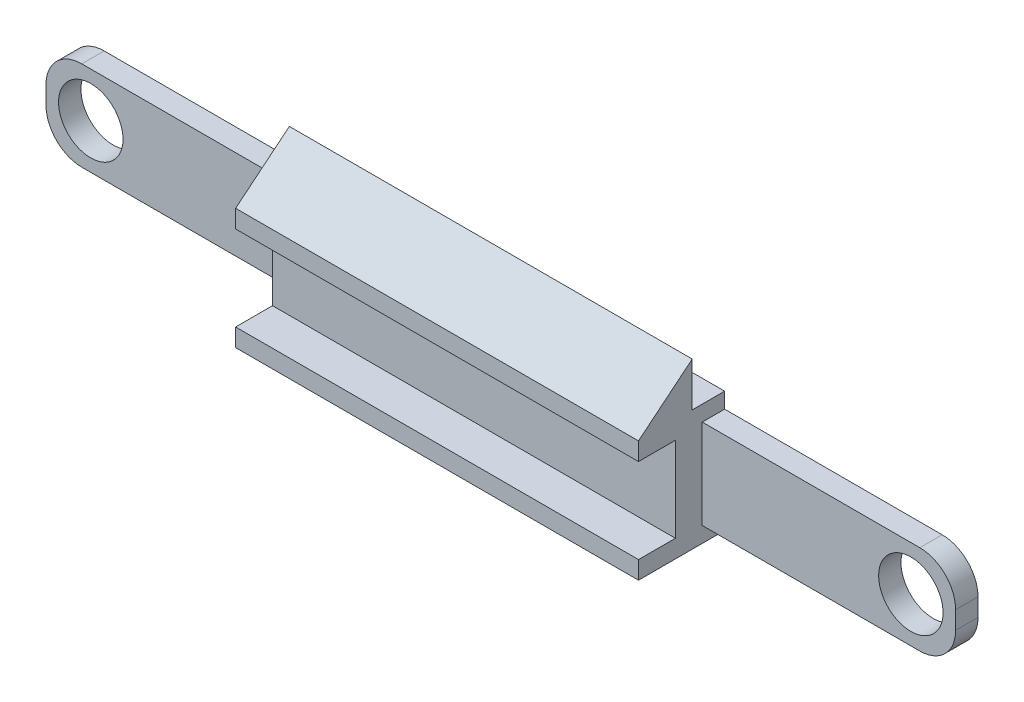
ISO-10303-21;
HEADER;
FILE_DESCRIPTION(('STEP AP214'),'2;1');
FILE_NAME('part.step','',(''),(''),'','','');
FILE_SCHEMA(('AUTOMOTIVE_DESIGN { 1 0 10303 214 1 1 1 1 }'));
ENDSEC;
DATA;
#1=APPLICATION_CONTEXT('core data for automotive mechanical design processes');
#2=APPLICATION_PROTOCOL_DEFINITION('international standard','automotive_design',2000,#1);
#3=PRODUCT_CONTEXT('',#1,'mechanical');
#4=PRODUCT('Part','Part','',(#3));
#5=PRODUCT_RELATED_PRODUCT_CATEGORY('part','',(#4));
#6=PRODUCT_DEFINITION_FORMATION('','',#4);
#7=PRODUCT_DEFINITION_CONTEXT('part definition',#1,'design');
#8=PRODUCT_DEFINITION('design','',#6,#7);
#9=PRODUCT_DEFINITION_SHAPE('','',#8);
#10=(LENGTH_UNIT() NAMED_UNIT(*) SI_UNIT(.MILLI.,.METRE.));
#11=(NAMED_UNIT(*) PLANE_ANGLE_UNIT() SI_UNIT($,.RADIAN.));
#12=(NAMED_UNIT(*) SI_UNIT($,.STERADIAN.) SOLID_ANGLE_UNIT());
#13=UNCERTAINTY_MEASURE_WITH_UNIT(LENGTH_MEASURE(1.E-05),#10,'distance_accuracy_value','');
#14=(GEOMETRIC_REPRESENTATION_CONTEXT(3) GLOBAL_UNCERTAINTY_ASSIGNED_CONTEXT((#13)) GLOBAL_UNIT_ASSIGNED_CONTEXT((#10,
#11,#12)) REPRESENTATION_CONTEXT('',''));
#15=CARTESIAN_POINT('',(0.,0.,0.));
#16=DIRECTION('',(0.,0.,1.));
#17=DIRECTION('',(1.,0.,0.));
#18=AXIS2_PLACEMENT_3D('',#15,#16,#17);
#19=CARTESIAN_POINT('',(59.436,-1.27,3.175));
#20=DIRECTION('',(0.,0.,1.));
#21=DIRECTION('',(1.,0.,0.));
#22=AXIS2_PLACEMENT_3D('',#19,#20,#21);
#23=PLANE('',#22);
#24=CARTESIAN_POINT('',(58.166,0.,3.175));
#25=DIRECTION('',(0.,0.,1.));
#26=DIRECTION('',(-1.,0.,0.));
#27=AXIS2_PLACEMENT_3D('',#24,#25,#26);
#28=CIRCLE('',#27,4.572);
#29=CARTESIAN_POINT('',(53.594,0.,3.175));
#30=VERTEX_POINT('',#29);
#31=EDGE_CURVE('E291',#30,#30,#28,.T.);
#32=ORIENTED_EDGE('',*,*,#31,.F.);
#33=EDGE_LOOP('',(#32));
#34=FACE_BOUND('',#33,.T.);
#35=DIRECTION('',(-1.,0.,0.));
#36=VECTOR('',#35,1.);
#37=CARTESIAN_POINT('',(59.436,6.35,3.175));
#38=LINE('',#37,#36);
#39=CARTESIAN_POINT('',(59.436,6.35,3.175));
#40=VERTEX_POINT('',#39);
#41=CARTESIAN_POINT('',(28.575,6.35,3.175));
#42=VERTEX_POINT('',#41);
#43=EDGE_CURVE('E312',#40,#42,#38,.T.);
#44=ORIENTED_EDGE('',*,*,#43,.T.);
#45=DIRECTION('',(0.,1.,0.));
#46=VECTOR('',#45,1.);
#47=CARTESIAN_POINT('',(28.575,0.330199999999999,3.175));
#48=LINE('',#47,#46);
#49=CARTESIAN_POINT('',(28.575,-6.35,3.175));
#50=VERTEX_POINT('',#49);
#51=EDGE_CURVE('E44',#50,#42,#48,.T.);
#52=ORIENTED_EDGE('',*,*,#51,.F.);
#53=DIRECTION('',(1.,0.,0.));
#54=VECTOR('',#53,1.);
#55=CARTESIAN_POINT('',(59.436,-6.35,3.175));
#56=LINE('',#55,#54);
#57=CARTESIAN_POINT('',(59.436,-6.35,3.175));
#58=VERTEX_POINT('',#57);
#59=EDGE_CURVE('E321',#50,#58,#56,.T.);
#60=ORIENTED_EDGE('',*,*,#59,.T.);
#61=CARTESIAN_POINT('',(59.436,-1.27,3.175));
#62=DIRECTION('',(0.,0.,1.));
#63=DIRECTION('',(1.,0.,0.));
#64=AXIS2_PLACEMENT_3D('',#61,#62,#63);
#65=CIRCLE('',#64,5.07999999999999);
#66=CARTESIAN_POINT('',(64.516,-1.27,3.175));
#67=VERTEX_POINT('',#66);
#68=EDGE_CURVE('E303',#58,#67,#65,.T.);
#69=ORIENTED_EDGE('',*,*,#68,.T.);
#70=DIRECTION('',(0.,1.,0.));
#71=VECTOR('',#70,1.);
#72=CARTESIAN_POINT('',(64.516,-1.27,3.175));
#73=LINE('',#72,#71);
#74=CARTESIAN_POINT('',(64.516,1.27,3.175));
#75=VERTEX_POINT('',#74);
#76=EDGE_CURVE('E306',#67,#75,#73,.T.);
#77=ORIENTED_EDGE('',*,*,#76,.T.);
#78=CARTESIAN_POINT('',(59.436,1.27,3.175));
#79=DIRECTION('',(0.,0.,1.));
#80=DIRECTION('',(1.,0.,0.));
#81=AXIS2_PLACEMENT_3D('',#78,#79,#80);
#82=CIRCLE('',#81,5.08);
#83=EDGE_CURVE('E309',#75,#40,#82,.T.);
#84=ORIENTED_EDGE('',*,*,#83,.T.);
#85=EDGE_LOOP('',(#44,#52,#60,#69,#77,#84));
#86=FACE_BOUND('',#85,.T.);
#87=ADVANCED_FACE('F35',(#34,#86),#23,.T.);
#88=CARTESIAN_POINT('',(59.436,6.35,3.175));
#89=DIRECTION('',(0.,-1.,0.));
#90=DIRECTION('',(0.,0.,-1.));
#91=AXIS2_PLACEMENT_3D('',#88,#89,#90);
#92=PLANE('',#91);
#93=CARTESIAN_POINT('',(-28.575,6.35,3.175));
#94=VERTEX_POINT('',#93);
#95=CARTESIAN_POINT('',(-59.436,6.35,3.175));
#96=VERTEX_POINT('',#95);
#97=EDGE_CURVE('E311',#94,#96,#38,.T.);
#98=ORIENTED_EDGE('',*,*,#97,.F.);
#99=DIRECTION('',(0.,0.,-1.));
#100=VECTOR('',#99,1.);
#101=CARTESIAN_POINT('',(-28.575,6.35,3.175));
#102=LINE('',#101,#100);
#103=CARTESIAN_POINT('',(-28.575,6.35,0.));
#104=VERTEX_POINT('',#103);
#105=EDGE_CURVE('E230',#94,#104,#102,.T.);
#106=ORIENTED_EDGE('',*,*,#105,.T.);
#107=DIRECTION('',(-1.,0.,0.));
#108=VECTOR('',#107,1.);
#109=CARTESIAN_POINT('',(59.436,6.35,0.));
#110=LINE('',#109,#108);
#111=CARTESIAN_POINT('',(-59.436,6.35,0.));
#112=VERTEX_POINT('',#111);
#113=EDGE_CURVE('E331',#104,#112,#110,.T.);
#114=ORIENTED_EDGE('',*,*,#113,.T.);
#115=DIRECTION('',(0.,0.,-1.));
#116=VECTOR('',#115,1.);
#117=CARTESIAN_POINT('',(-59.436,6.35,3.175));
#118=LINE('',#117,#116);
#119=EDGE_CURVE('E354',#96,#112,#118,.T.);
#120=ORIENTED_EDGE('',*,*,#119,.F.);
#121=EDGE_LOOP('',(#98,#106,#114,#120));
#122=FACE_BOUND('',#121,.T.);
#123=ADVANCED_FACE('F422',(#122),#92,.F.);
#124=DIRECTION('',(0.,1.,0.));
#125=VECTOR('',#124,1.);
#126=CARTESIAN_POINT('',(-28.575,0.330199999999999,3.175));
#127=LINE('',#126,#125);
#128=CARTESIAN_POINT('',(-28.575,-6.35,3.175));
#129=VERTEX_POINT('',#128);
#130=EDGE_CURVE('E11',#129,#94,#127,.T.);
#131=ORIENTED_EDGE('',*,*,#130,.T.);
#132=ORIENTED_EDGE('',*,*,#97,.T.);
#133=CARTESIAN_POINT('',(-59.436,1.27,3.175));
#134=DIRECTION('',(0.,0.,1.));
#135=DIRECTION('',(1.,0.,0.));
#136=AXIS2_PLACEMENT_3D('',#133,#134,#135);
#137=CIRCLE('',#136,5.08);
#138=CARTESIAN_POINT('',(-64.516,1.27,3.175));
#139=VERTEX_POINT('',#138);
#140=EDGE_CURVE('E315',#96,#139,#137,.T.);
#141=ORIENTED_EDGE('',*,*,#140,.T.);
#142=DIRECTION('',(0.,-1.,0.));
#143=VECTOR('',#142,1.);
#144=CARTESIAN_POINT('',(-64.516,-1.27,3.175));
#145=LINE('',#144,#143);
#146=CARTESIAN_POINT('',(-64.516,-1.27,3.175));
#147=VERTEX_POINT('',#146);
#148=EDGE_CURVE('E317',#139,#147,#145,.T.);
#149=ORIENTED_EDGE('',*,*,#148,.T.);
#150=CARTESIAN_POINT('',(-59.436,-1.27,3.175));
#151=DIRECTION('',(0.,0.,1.));
#152=DIRECTION('',(-1.,0.,0.));
#153=AXIS2_PLACEMENT_3D('',#150,#151,#152);
#154=CIRCLE('',#153,5.07999999999999);
#155=CARTESIAN_POINT('',(-59.436,-6.35,3.175));
#156=VERTEX_POINT('',#155);
#157=EDGE_CURVE('E319',#147,#156,#154,.T.);
#158=ORIENTED_EDGE('',*,*,#157,.T.);
#159=EDGE_CURVE('E322',#156,#129,#56,.T.);
#160=ORIENTED_EDGE('',*,*,#159,.T.);
#161=EDGE_LOOP('',(#131,#132,#141,#149,#158,#160));
#162=FACE_BOUND('',#161,.T.);
#163=CARTESIAN_POINT('',(-58.166,0.,3.175));
#164=DIRECTION('',(0.,0.,1.));
#165=DIRECTION('',(1.,0.,0.));
#166=AXIS2_PLACEMENT_3D('',#163,#164,#165);
#167=CIRCLE('',#166,4.572);
#168=CARTESIAN_POINT('',(-53.594,0.,3.175));
#169=VERTEX_POINT('',#168);
#170=EDGE_CURVE('E297',#169,#169,#167,.T.);
#171=ORIENTED_EDGE('',*,*,#170,.F.);
#172=EDGE_LOOP('',(#171));
#173=FACE_BOUND('',#172,.T.);
#174=ADVANCED_FACE('F453',(#162,#173),#23,.T.);
#175=CARTESIAN_POINT('',(59.436,-6.35,3.175));
#176=DIRECTION('',(0.,1.,0.));
#177=DIRECTION('',(0.,0.,1.));
#178=AXIS2_PLACEMENT_3D('',#175,#176,#177);
#179=PLANE('',#178);
#180=DIRECTION('',(0.,0.,-1.));
#181=VECTOR('',#180,1.);
#182=CARTESIAN_POINT('',(-28.575,-6.35,3.175));
#183=LINE('',#182,#181);
#184=CARTESIAN_POINT('',(-28.575,-6.35,0.));
#185=VERTEX_POINT('',#184);
#186=EDGE_CURVE('E273',#129,#185,#183,.T.);
#187=ORIENTED_EDGE('',*,*,#186,.F.);
#188=ORIENTED_EDGE('',*,*,#159,.F.);
#189=DIRECTION('',(0.,0.,-1.));
#190=VECTOR('',#189,1.);
#191=CARTESIAN_POINT('',(-59.436,-6.35,3.175));
#192=LINE('',#191,#190);
#193=CARTESIAN_POINT('',(-59.436,-6.35,0.));
#194=VERTEX_POINT('',#193);
#195=EDGE_CURVE('E345',#156,#194,#192,.T.);
#196=ORIENTED_EDGE('',*,*,#195,.T.);
#197=DIRECTION('',(1.,0.,0.));
#198=VECTOR('',#197,1.);
#199=CARTESIAN_POINT('',(59.436,-6.35,0.));
#200=LINE('',#199,#198);
#201=EDGE_CURVE('E307',#194,#185,#200,.T.);
#202=ORIENTED_EDGE('',*,*,#201,.T.);
#203=EDGE_LOOP('',(#187,#188,#196,#202));
#204=FACE_BOUND('',#203,.T.);
#205=ADVANCED_FACE('F402',(#204),#179,.F.);
#206=DIRECTION('',(0.,0.,1.));
#207=VECTOR('',#206,1.);
#208=CARTESIAN_POINT('',(28.575,-6.35,3.17500000000001));
#209=LINE('',#208,#207);
#210=CARTESIAN_POINT('',(28.575,-6.35,0.));
#211=VERTEX_POINT('',#210);
#212=EDGE_CURVE('E278',#211,#50,#209,.T.);
#213=ORIENTED_EDGE('',*,*,#212,.F.);
#214=CARTESIAN_POINT('',(59.436,-6.35,0.));
#215=VERTEX_POINT('',#214);
#216=EDGE_CURVE('E340',#211,#215,#200,.T.);
#217=ORIENTED_EDGE('',*,*,#216,.T.);
#218=DIRECTION('',(0.,0.,-1.));
#219=VECTOR('',#218,1.);
#220=CARTESIAN_POINT('',(59.436,-6.35,3.175));
#221=LINE('',#220,#219);
#222=EDGE_CURVE('E324',#58,#215,#221,.T.);
#223=ORIENTED_EDGE('',*,*,#222,.F.);
#224=ORIENTED_EDGE('',*,*,#59,.F.);
#225=EDGE_LOOP('',(#213,#217,#223,#224));
#226=FACE_BOUND('',#225,.T.);
#227=ADVANCED_FACE('F389',(#226),#179,.F.);
#228=CARTESIAN_POINT('',(59.436,-1.27,0.));
#229=DIRECTION('',(0.,0.,1.));
#230=DIRECTION('',(1.,0.,0.));
#231=AXIS2_PLACEMENT_3D('',#228,#229,#230);
#232=PLANE('',#231);
#233=CARTESIAN_POINT('',(59.436,-1.27,0.));
#234=DIRECTION('',(0.,0.,1.));
#235=DIRECTION('',(1.,0.,0.));
#236=AXIS2_PLACEMENT_3D('',#233,#234,#235);
#237=CIRCLE('',#236,5.07999999999999);
#238=CARTESIAN_POINT('',(64.516,-1.27,0.));
#239=VERTEX_POINT('',#238);
#240=EDGE_CURVE('E300',#215,#239,#237,.T.);
#241=ORIENTED_EDGE('',*,*,#240,.F.);
#242=ORIENTED_EDGE('',*,*,#216,.F.);
#243=DIRECTION('',(0.,1.,0.));
#244=VECTOR('',#243,1.);
#245=CARTESIAN_POINT('',(28.575,-8.5598,0.));
#246=LINE('',#245,#244);
#247=CARTESIAN_POINT('',(28.575,-8.5598,0.));
#248=VERTEX_POINT('',#247);
#249=EDGE_CURVE('E282',#248,#211,#246,.T.);
#250=ORIENTED_EDGE('',*,*,#249,.F.);
#251=DIRECTION('',(1.,0.,0.));
#252=VECTOR('',#251,1.);
#253=CARTESIAN_POINT('',(-28.575,-8.5598,0.));
#254=LINE('',#253,#252);
#255=CARTESIAN_POINT('',(-28.575,-8.5598,0.));
#256=VERTEX_POINT('',#255);
#257=EDGE_CURVE('E277',#256,#248,#254,.T.);
#258=ORIENTED_EDGE('',*,*,#257,.F.);
#259=DIRECTION('',(0.,1.,0.));
#260=VECTOR('',#259,1.);
#261=CARTESIAN_POINT('',(-28.575,-8.5598,0.));
#262=LINE('',#261,#260);
#263=EDGE_CURVE('E288',#256,#185,#262,.T.);
#264=ORIENTED_EDGE('',*,*,#263,.T.);
#265=ORIENTED_EDGE('',*,*,#201,.F.);
#266=CARTESIAN_POINT('',(-59.436,-1.27,0.));
#267=DIRECTION('',(0.,0.,1.));
#268=DIRECTION('',(-1.,0.,0.));
#269=AXIS2_PLACEMENT_3D('',#266,#267,#268);
#270=CIRCLE('',#269,5.07999999999999);
#271=CARTESIAN_POINT('',(-64.516,-1.27,0.));
#272=VERTEX_POINT('',#271);
#273=EDGE_CURVE('E338',#272,#194,#270,.T.);
#274=ORIENTED_EDGE('',*,*,#273,.F.);
#275=DIRECTION('',(0.,-1.,0.));
#276=VECTOR('',#275,1.);
#277=CARTESIAN_POINT('',(-64.516,-1.27,0.));
#278=LINE('',#277,#276);
#279=CARTESIAN_POINT('',(-64.516,1.27,0.));
#280=VERTEX_POINT('',#279);
#281=EDGE_CURVE('E336',#280,#272,#278,.T.);
#282=ORIENTED_EDGE('',*,*,#281,.F.);
#283=CARTESIAN_POINT('',(-59.436,1.27,0.));
#284=DIRECTION('',(0.,0.,1.));
#285=DIRECTION('',(1.,0.,0.));
#286=AXIS2_PLACEMENT_3D('',#283,#284,#285);
#287=CIRCLE('',#286,5.08);
#288=EDGE_CURVE('E334',#112,#280,#287,.T.);
#289=ORIENTED_EDGE('',*,*,#288,.F.);
#290=ORIENTED_EDGE('',*,*,#113,.F.);
#291=DIRECTION('',(0.,-1.,0.));
#292=VECTOR('',#291,1.);
#293=CARTESIAN_POINT('',(-28.575,8.5598,0.));
#294=LINE('',#293,#292);
#295=CARTESIAN_POINT('',(-28.575,8.5598,0.));
#296=VERTEX_POINT('',#295);
#297=EDGE_CURVE('E239',#296,#104,#294,.T.);
#298=ORIENTED_EDGE('',*,*,#297,.F.);
#299=DIRECTION('',(1.,0.,0.));
#300=VECTOR('',#299,1.);
#301=CARTESIAN_POINT('',(-28.575,8.5598,0.));
#302=LINE('',#301,#300);
#303=CARTESIAN_POINT('',(28.575,8.5598,0.));
#304=VERTEX_POINT('',#303);
#305=EDGE_CURVE('E236',#296,#304,#302,.T.);
#306=ORIENTED_EDGE('',*,*,#305,.T.);
#307=DIRECTION('',(0.,-1.,0.));
#308=VECTOR('',#307,1.);
#309=CARTESIAN_POINT('',(28.575,8.5598,0.));
#310=LINE('',#309,#308);
#311=CARTESIAN_POINT('',(28.575,6.35,0.));
#312=VERTEX_POINT('',#311);
#313=EDGE_CURVE('E246',#304,#312,#310,.T.);
#314=ORIENTED_EDGE('',*,*,#313,.T.);
#315=CARTESIAN_POINT('',(59.436,6.35,0.));
#316=VERTEX_POINT('',#315);
#317=EDGE_CURVE('E332',#316,#312,#110,.T.);
#318=ORIENTED_EDGE('',*,*,#317,.F.);
#319=CARTESIAN_POINT('',(59.436,1.27,0.));
#320=DIRECTION('',(0.,0.,1.));
#321=DIRECTION('',(1.,0.,0.));
#322=AXIS2_PLACEMENT_3D('',#319,#320,#321);
#323=CIRCLE('',#322,5.08);
#324=CARTESIAN_POINT('',(64.516,1.27,0.));
#325=VERTEX_POINT('',#324);
#326=EDGE_CURVE('E329',#325,#316,#323,.T.);
#327=ORIENTED_EDGE('',*,*,#326,.F.);
#328=DIRECTION('',(0.,1.,0.));
#329=VECTOR('',#328,1.);
#330=CARTESIAN_POINT('',(64.516,-1.27,0.));
#331=LINE('',#330,#329);
#332=EDGE_CURVE('E327',#239,#325,#331,.T.);
#333=ORIENTED_EDGE('',*,*,#332,.F.);
#334=EDGE_LOOP('',(#241,#242,#250,#258,#264,#265,#274,#282,#289,#290,#298,#306,#314,#318,#327,#333));
#335=FACE_BOUND('',#334,.T.);
#336=CARTESIAN_POINT('',(-58.166,0.,0.));
#337=DIRECTION('',(0.,0.,1.));
#338=DIRECTION('',(1.,0.,0.));
#339=AXIS2_PLACEMENT_3D('',#336,#337,#338);
#340=CIRCLE('',#339,4.572);
#341=CARTESIAN_POINT('',(-53.594,0.,0.));
#342=VERTEX_POINT('',#341);
#343=EDGE_CURVE('E294',#342,#342,#340,.T.);
#344=ORIENTED_EDGE('',*,*,#343,.T.);
#345=EDGE_LOOP('',(#344));
#346=FACE_BOUND('',#345,.T.);
#347=CARTESIAN_POINT('',(58.166,0.,0.));
#348=DIRECTION('',(0.,0.,1.));
#349=DIRECTION('',(-1.,0.,0.));
#350=AXIS2_PLACEMENT_3D('',#347,#348,#349);
#351=CIRCLE('',#350,4.572);
#352=CARTESIAN_POINT('',(53.594,0.,0.));
#353=VERTEX_POINT('',#352);
#354=EDGE_CURVE('E290',#353,#353,#351,.T.);
#355=ORIENTED_EDGE('',*,*,#354,.T.);
#356=EDGE_LOOP('',(#355));
#357=FACE_BOUND('',#356,.T.);
#358=ADVANCED_FACE('F375',(#335,#346,#357),#232,.F.);
#359=CARTESIAN_POINT('',(59.436,-1.27,3.175));
#360=DIRECTION('',(0.,0.,-1.));
#361=DIRECTION('',(-1.,0.,0.));
#362=AXIS2_PLACEMENT_3D('',#359,#360,#361);
#363=CYLINDRICAL_SURFACE('',#362,5.07999999999999);
#364=ORIENTED_EDGE('',*,*,#240,.T.);
#365=DIRECTION('',(0.,0.,-1.));
#366=VECTOR('',#365,1.);
#367=CARTESIAN_POINT('',(64.516,-1.27,3.175));
#368=LINE('',#367,#366);
#369=EDGE_CURVE('E39',#67,#239,#368,.T.);
#370=ORIENTED_EDGE('',*,*,#369,.F.);
#371=ORIENTED_EDGE('',*,*,#68,.F.);
#372=ORIENTED_EDGE('',*,*,#222,.T.);
#373=EDGE_LOOP('',(#364,#370,#371,#372));
#374=FACE_BOUND('',#373,.T.);
#375=ADVANCED_FACE('F37',(#374),#363,.T.);
#376=CARTESIAN_POINT('',(64.516,-1.27,3.175));
#377=DIRECTION('',(-1.,0.,0.));
#378=DIRECTION('',(0.,-1.,0.));
#379=AXIS2_PLACEMENT_3D('',#376,#377,#378);
#380=PLANE('',#379);
#381=ORIENTED_EDGE('',*,*,#332,.T.);
#382=DIRECTION('',(0.,0.,-1.));
#383=VECTOR('',#382,1.);
#384=CARTESIAN_POINT('',(64.516,1.27,3.175));
#385=LINE('',#384,#383);
#386=EDGE_CURVE('E359',#75,#325,#385,.T.);
#387=ORIENTED_EDGE('',*,*,#386,.F.);
#388=ORIENTED_EDGE('',*,*,#76,.F.);
#389=ORIENTED_EDGE('',*,*,#369,.T.);
#390=EDGE_LOOP('',(#381,#387,#388,#389));
#391=FACE_BOUND('',#390,.T.);
#392=ADVANCED_FACE('F368',(#391),#380,.F.);
#393=CARTESIAN_POINT('',(59.436,1.27,3.175));
#394=DIRECTION('',(0.,0.,-1.));
#395=DIRECTION('',(-1.,0.,0.));
#396=AXIS2_PLACEMENT_3D('',#393,#394,#395);
#397=CYLINDRICAL_SURFACE('',#396,5.08);
#398=ORIENTED_EDGE('',*,*,#326,.T.);
#399=DIRECTION('',(0.,0.,-1.));
#400=VECTOR('',#399,1.);
#401=CARTESIAN_POINT('',(59.436,6.35,3.175));
#402=LINE('',#401,#400);
#403=EDGE_CURVE('E357',#40,#316,#402,.T.);
#404=ORIENTED_EDGE('',*,*,#403,.F.);
#405=ORIENTED_EDGE('',*,*,#83,.F.);
#406=ORIENTED_EDGE('',*,*,#386,.T.);
#407=EDGE_LOOP('',(#398,#404,#405,#406));
#408=FACE_BOUND('',#407,.T.);
#409=ADVANCED_FACE('F380',(#408),#397,.T.);
#410=ORIENTED_EDGE('',*,*,#317,.T.);
#411=DIRECTION('',(0.,0.,1.));
#412=VECTOR('',#411,1.);
#413=CARTESIAN_POINT('',(28.575,6.35,3.17500000000001));
#414=LINE('',#413,#412);
#415=EDGE_CURVE('E234',#312,#42,#414,.T.);
#416=ORIENTED_EDGE('',*,*,#415,.T.);
#417=ORIENTED_EDGE('',*,*,#43,.F.);
#418=ORIENTED_EDGE('',*,*,#403,.T.);
#419=EDGE_LOOP('',(#410,#416,#417,#418));
#420=FACE_BOUND('',#419,.T.);
#421=ADVANCED_FACE('F383',(#420),#92,.F.);
#422=CARTESIAN_POINT('',(-59.436,1.27,3.175));
#423=DIRECTION('',(0.,0.,-1.));
#424=DIRECTION('',(-1.,0.,0.));
#425=AXIS2_PLACEMENT_3D('',#422,#423,#424);
#426=CYLINDRICAL_SURFACE('',#425,5.08);
#427=ORIENTED_EDGE('',*,*,#288,.T.);
#428=DIRECTION('',(0.,0.,-1.));
#429=VECTOR('',#428,1.);
#430=CARTESIAN_POINT('',(-64.516,1.27,3.175));
#431=LINE('',#430,#429);
#432=EDGE_CURVE('E351',#139,#280,#431,.T.);
#433=ORIENTED_EDGE('',*,*,#432,.F.);
#434=ORIENTED_EDGE('',*,*,#140,.F.);
#435=ORIENTED_EDGE('',*,*,#119,.T.);
#436=EDGE_LOOP('',(#427,#433,#434,#435));
#437=FACE_BOUND('',#436,.T.);
#438=ADVANCED_FACE('F417',(#437),#426,.T.);
#439=CARTESIAN_POINT('',(-64.516,-1.27,3.175));
#440=DIRECTION('',(1.,0.,0.));
#441=DIRECTION('',(0.,1.,0.));
#442=AXIS2_PLACEMENT_3D('',#439,#440,#441);
#443=PLANE('',#442);
#444=ORIENTED_EDGE('',*,*,#281,.T.);
#445=DIRECTION('',(0.,0.,-1.));
#446=VECTOR('',#445,1.);
#447=CARTESIAN_POINT('',(-64.516,-1.27,3.175));
#448=LINE('',#447,#446);
#449=EDGE_CURVE('E348',#147,#272,#448,.T.);
#450=ORIENTED_EDGE('',*,*,#449,.F.);
#451=ORIENTED_EDGE('',*,*,#148,.F.);
#452=ORIENTED_EDGE('',*,*,#432,.T.);
#453=EDGE_LOOP('',(#444,#450,#451,#452));
#454=FACE_BOUND('',#453,.T.);
#455=ADVANCED_FACE('F413',(#454),#443,.F.);
#456=CARTESIAN_POINT('',(-59.436,-1.27,3.175));
#457=DIRECTION('',(0.,0.,-1.));
#458=DIRECTION('',(-1.,0.,0.));
#459=AXIS2_PLACEMENT_3D('',#456,#457,#458);
#460=CYLINDRICAL_SURFACE('',#459,5.07999999999999);
#461=ORIENTED_EDGE('',*,*,#273,.T.);
#462=ORIENTED_EDGE('',*,*,#195,.F.);
#463=ORIENTED_EDGE('',*,*,#157,.F.);
#464=ORIENTED_EDGE('',*,*,#449,.T.);
#465=EDGE_LOOP('',(#461,#462,#463,#464));
#466=FACE_BOUND('',#465,.T.);
#467=ADVANCED_FACE('F408',(#466),#460,.T.);
#468=CARTESIAN_POINT('',(-58.166,0.,3.175));
#469=DIRECTION('',(0.,0.,-1.));
#470=DIRECTION('',(-1.,0.,0.));
#471=AXIS2_PLACEMENT_3D('',#468,#469,#470);
#472=CYLINDRICAL_SURFACE('',#471,4.572);
#473=ORIENTED_EDGE('',*,*,#170,.T.);
#474=EDGE_LOOP('',(#473));
#475=FACE_BOUND('',#474,.T.);
#476=ORIENTED_EDGE('',*,*,#343,.F.);
#477=EDGE_LOOP('',(#476));
#478=FACE_BOUND('',#477,.T.);
#479=ADVANCED_FACE('F469',(#475,#478),#472,.F.);
#480=CARTESIAN_POINT('',(58.166,0.,3.175));
#481=DIRECTION('',(0.,0.,-1.));
#482=DIRECTION('',(-1.,0.,0.));
#483=AXIS2_PLACEMENT_3D('',#480,#481,#482);
#484=CYLINDRICAL_SURFACE('',#483,4.572);
#485=ORIENTED_EDGE('',*,*,#31,.T.);
#486=EDGE_LOOP('',(#485));
#487=FACE_BOUND('',#486,.T.);
#488=ORIENTED_EDGE('',*,*,#354,.F.);
#489=EDGE_LOOP('',(#488));
#490=FACE_BOUND('',#489,.T.);
#491=ADVANCED_FACE('F472',(#487,#490),#484,.F.);
#492=CARTESIAN_POINT('',(-28.575,-8.5598,3.175));
#493=DIRECTION('',(1.,0.,0.));
#494=DIRECTION('',(0.,0.,-1.));
#495=AXIS2_PLACEMENT_3D('',#492,#493,#494);
#496=PLANE('',#495);
#497=DIRECTION('',(0.,0.,1.));
#498=VECTOR('',#497,1.);
#499=CARTESIAN_POINT('',(-28.575,-6.0198,12.2174));
#500=LINE('',#499,#498);
#501=CARTESIAN_POINT('',(-28.575,-6.0198,6.985));
#502=VERTEX_POINT('',#501);
#503=CARTESIAN_POINT('',(-28.575,-6.0198,12.2174));
#504=VERTEX_POINT('',#503);
#505=EDGE_CURVE('E261',#502,#504,#500,.T.);
#506=ORIENTED_EDGE('',*,*,#505,.F.);
#507=DIRECTION('',(0.,-1.,0.));
#508=VECTOR('',#507,1.);
#509=CARTESIAN_POINT('',(-28.575,-6.0198,6.985));
#510=LINE('',#509,#508);
#511=CARTESIAN_POINT('',(-28.575,6.0198,6.985));
#512=VERTEX_POINT('',#511);
#513=EDGE_CURVE('E249',#512,#502,#510,.T.);
#514=ORIENTED_EDGE('',*,*,#513,.F.);
#515=DIRECTION('',(0.,0.,1.));
#516=VECTOR('',#515,1.);
#517=CARTESIAN_POINT('',(-28.575,6.0198,12.2174));
#518=LINE('',#517,#516);
#519=CARTESIAN_POINT('',(-28.575,6.0198,12.2174));
#520=VERTEX_POINT('',#519);
#521=EDGE_CURVE('E218',#512,#520,#518,.T.);
#522=ORIENTED_EDGE('',*,*,#521,.T.);
#523=DIRECTION('',(0.,1.,0.));
#524=VECTOR('',#523,1.);
#525=CARTESIAN_POINT('',(-28.575,8.5598,12.2174));
#526=LINE('',#525,#524);
#527=CARTESIAN_POINT('',(-28.575,8.5598,12.2174));
#528=VERTEX_POINT('',#527);
#529=EDGE_CURVE('E206',#520,#528,#526,.T.);
#530=ORIENTED_EDGE('',*,*,#529,.T.);
#531=DIRECTION('',(0.,0.634079588207047,-0.773267790496399));
#532=VECTOR('',#531,1.);
#533=CARTESIAN_POINT('',(-28.575,8.5598,12.2174));
#534=LINE('',#533,#532);
#535=CARTESIAN_POINT('',(-28.575,14.8082,4.5974));
#536=VERTEX_POINT('',#535);
#537=EDGE_CURVE('E191',#528,#536,#534,.T.);
#538=ORIENTED_EDGE('',*,*,#537,.T.);
#539=DIRECTION('',(0.,-1.,0.));
#540=VECTOR('',#539,1.);
#541=CARTESIAN_POINT('',(-28.575,14.8082,4.5974));
#542=LINE('',#541,#540);
#543=CARTESIAN_POINT('',(-28.575,8.5598,4.5974));
#544=VERTEX_POINT('',#543);
#545=EDGE_CURVE('E197',#536,#544,#542,.T.);
#546=ORIENTED_EDGE('',*,*,#545,.T.);
#547=DIRECTION('',(0.,0.,-1.));
#548=VECTOR('',#547,1.);
#549=CARTESIAN_POINT('',(-28.575,8.5598,3.175));
#550=LINE('',#549,#548);
#551=EDGE_CURVE('E231',#544,#296,#550,.T.);
#552=ORIENTED_EDGE('',*,*,#551,.T.);
#553=ORIENTED_EDGE('',*,*,#297,.T.);
#554=ORIENTED_EDGE('',*,*,#105,.F.);
#555=ORIENTED_EDGE('',*,*,#130,.F.);
#556=ORIENTED_EDGE('',*,*,#186,.T.);
#557=ORIENTED_EDGE('',*,*,#263,.F.);
#558=DIRECTION('',(0.,0.,-1.));
#559=VECTOR('',#558,1.);
#560=CARTESIAN_POINT('',(-28.575,-8.5598,3.175));
#561=LINE('',#560,#559);
#562=CARTESIAN_POINT('',(-28.575,-8.5598,12.2174));
#563=VERTEX_POINT('',#562);
#564=EDGE_CURVE('E274',#563,#256,#561,.T.);
#565=ORIENTED_EDGE('',*,*,#564,.F.);
#566=DIRECTION('',(0.,-1.,0.));
#567=VECTOR('',#566,1.);
#568=CARTESIAN_POINT('',(-28.575,-8.5598,12.2174));
#569=LINE('',#568,#567);
#570=EDGE_CURVE('E254',#504,#563,#569,.T.);
#571=ORIENTED_EDGE('',*,*,#570,.F.);
#572=EDGE_LOOP('',(#506,#514,#522,#530,#538,#546,#552,#553,#554,#555,#556,#557,#565,#571));
#573=FACE_BOUND('',#572,.T.);
#574=ADVANCED_FACE('F203',(#573),#496,.F.);
#575=CARTESIAN_POINT('',(28.575,-8.5598,3.17500000000001));
#576=DIRECTION('',(-1.,0.,0.));
#577=DIRECTION('',(0.,0.,1.));
#578=AXIS2_PLACEMENT_3D('',#575,#576,#577);
#579=PLANE('',#578);
#580=ORIENTED_EDGE('',*,*,#51,.T.);
#581=ORIENTED_EDGE('',*,*,#415,.F.);
#582=ORIENTED_EDGE('',*,*,#313,.F.);
#583=DIRECTION('',(0.,0.,1.));
#584=VECTOR('',#583,1.);
#585=CARTESIAN_POINT('',(28.575,8.5598,3.17500000000001));
#586=LINE('',#585,#584);
#587=CARTESIAN_POINT('',(28.575,8.5598,4.5974));
#588=VERTEX_POINT('',#587);
#589=EDGE_CURVE('E233',#304,#588,#586,.T.);
#590=ORIENTED_EDGE('',*,*,#589,.T.);
#591=DIRECTION('',(0.,1.,0.));
#592=VECTOR('',#591,1.);
#593=CARTESIAN_POINT('',(28.575,14.8082,4.5974));
#594=LINE('',#593,#592);
#595=CARTESIAN_POINT('',(28.575,14.8082,4.5974));
#596=VERTEX_POINT('',#595);
#597=EDGE_CURVE('E212',#588,#596,#594,.T.);
#598=ORIENTED_EDGE('',*,*,#597,.T.);
#599=DIRECTION('',(0.,-0.634079588207047,0.773267790496399));
#600=VECTOR('',#599,1.);
#601=CARTESIAN_POINT('',(28.575,8.5598,12.2174));
#602=LINE('',#601,#600);
#603=CARTESIAN_POINT('',(28.575,8.5598,12.2174));
#604=VERTEX_POINT('',#603);
#605=EDGE_CURVE('E193',#596,#604,#602,.T.);
#606=ORIENTED_EDGE('',*,*,#605,.T.);
#607=DIRECTION('',(0.,1.,0.));
#608=VECTOR('',#607,1.);
#609=CARTESIAN_POINT('',(28.575,8.5598,12.2174));
#610=LINE('',#609,#608);
#611=CARTESIAN_POINT('',(28.575,6.0198,12.2174));
#612=VERTEX_POINT('',#611);
#613=EDGE_CURVE('E215',#612,#604,#610,.T.);
#614=ORIENTED_EDGE('',*,*,#613,.F.);
#615=DIRECTION('',(0.,0.,1.));
#616=VECTOR('',#615,1.);
#617=CARTESIAN_POINT('',(28.575,6.0198,12.2174));
#618=LINE('',#617,#616);
#619=CARTESIAN_POINT('',(28.575,6.0198,6.985));
#620=VERTEX_POINT('',#619);
#621=EDGE_CURVE('E217',#620,#612,#618,.T.);
#622=ORIENTED_EDGE('',*,*,#621,.F.);
#623=DIRECTION('',(0.,-1.,0.));
#624=VECTOR('',#623,1.);
#625=CARTESIAN_POINT('',(28.575,-6.0198,6.985));
#626=LINE('',#625,#624);
#627=CARTESIAN_POINT('',(28.575,-6.0198,6.985));
#628=VERTEX_POINT('',#627);
#629=EDGE_CURVE('E251',#620,#628,#626,.T.);
#630=ORIENTED_EDGE('',*,*,#629,.T.);
#631=DIRECTION('',(0.,0.,1.));
#632=VECTOR('',#631,1.);
#633=CARTESIAN_POINT('',(28.575,-6.0198,12.2174));
#634=LINE('',#633,#632);
#635=CARTESIAN_POINT('',(28.575,-6.0198,12.2174));
#636=VERTEX_POINT('',#635);
#637=EDGE_CURVE('E253',#628,#636,#634,.T.);
#638=ORIENTED_EDGE('',*,*,#637,.T.);
#639=DIRECTION('',(0.,-1.,0.));
#640=VECTOR('',#639,1.);
#641=CARTESIAN_POINT('',(28.575,-8.5598,12.2174));
#642=LINE('',#641,#640);
#643=CARTESIAN_POINT('',(28.575,-8.5598,12.2174));
#644=VERTEX_POINT('',#643);
#645=EDGE_CURVE('E256',#636,#644,#642,.T.);
#646=ORIENTED_EDGE('',*,*,#645,.T.);
#647=DIRECTION('',(0.,0.,1.));
#648=VECTOR('',#647,1.);
#649=CARTESIAN_POINT('',(28.575,-8.5598,3.17500000000001));
#650=LINE('',#649,#648);
#651=EDGE_CURVE('E280',#248,#644,#650,.T.);
#652=ORIENTED_EDGE('',*,*,#651,.F.);
#653=ORIENTED_EDGE('',*,*,#249,.T.);
#654=ORIENTED_EDGE('',*,*,#212,.T.);
#655=EDGE_LOOP('',(#580,#581,#582,#590,#598,#606,#614,#622,#630,#638,#646,#652,#653,#654));
#656=FACE_BOUND('',#655,.T.);
#657=ADVANCED_FACE('F391',(#656),#579,.F.);
#658=CARTESIAN_POINT('',(0.,-8.5598,0.));
#659=DIRECTION('',(0.,-1.,0.));
#660=DIRECTION('',(0.,0.,-1.));
#661=AXIS2_PLACEMENT_3D('',#658,#659,#660);
#662=PLANE('',#661);
#663=ORIENTED_EDGE('',*,*,#564,.T.);
#664=ORIENTED_EDGE('',*,*,#257,.T.);
#665=ORIENTED_EDGE('',*,*,#651,.T.);
#666=DIRECTION('',(-1.,0.,0.));
#667=VECTOR('',#666,1.);
#668=CARTESIAN_POINT('',(28.575,-8.5598,12.2174));
#669=LINE('',#668,#667);
#670=EDGE_CURVE('E258',#644,#563,#669,.T.);
#671=ORIENTED_EDGE('',*,*,#670,.T.);
#672=EDGE_LOOP('',(#663,#664,#665,#671));
#673=FACE_BOUND('',#672,.T.);
#674=ADVANCED_FACE('F396',(#673),#662,.T.);
#675=CARTESIAN_POINT('',(28.575,-6.0198,6.985));
#676=DIRECTION('',(0.,0.,-1.));
#677=DIRECTION('',(-1.,0.,0.));
#678=AXIS2_PLACEMENT_3D('',#675,#676,#677);
#679=PLANE('',#678);
#680=DIRECTION('',(-1.,0.,0.));
#681=VECTOR('',#680,1.);
#682=CARTESIAN_POINT('',(28.575,-6.0198,6.985));
#683=LINE('',#682,#681);
#684=EDGE_CURVE('E270',#628,#502,#683,.T.);
#685=ORIENTED_EDGE('',*,*,#684,.F.);
#686=ORIENTED_EDGE('',*,*,#629,.F.);
#687=DIRECTION('',(-1.,0.,0.));
#688=VECTOR('',#687,1.);
#689=CARTESIAN_POINT('',(28.575,6.0198,6.985));
#690=LINE('',#689,#688);
#691=EDGE_CURVE('E221',#620,#512,#690,.T.);
#692=ORIENTED_EDGE('',*,*,#691,.T.);
#693=ORIENTED_EDGE('',*,*,#513,.T.);
#694=EDGE_LOOP('',(#685,#686,#692,#693));
#695=FACE_BOUND('',#694,.T.);
#696=ADVANCED_FACE('F436',(#695),#679,.F.);
#697=CARTESIAN_POINT('',(28.575,-6.0198,12.2174));
#698=DIRECTION('',(0.,-1.,0.));
#699=DIRECTION('',(0.,0.,-1.));
#700=AXIS2_PLACEMENT_3D('',#697,#698,#699);
#701=PLANE('',#700);
#702=ORIENTED_EDGE('',*,*,#505,.T.);
#703=DIRECTION('',(-1.,0.,0.));
#704=VECTOR('',#703,1.);
#705=CARTESIAN_POINT('',(28.575,-6.0198,12.2174));
#706=LINE('',#705,#704);
#707=EDGE_CURVE('E267',#636,#504,#706,.T.);
#708=ORIENTED_EDGE('',*,*,#707,.F.);
#709=ORIENTED_EDGE('',*,*,#637,.F.);
#710=ORIENTED_EDGE('',*,*,#684,.T.);
#711=EDGE_LOOP('',(#702,#708,#709,#710));
#712=FACE_BOUND('',#711,.T.);
#713=ADVANCED_FACE('F438',(#712),#701,.F.);
#714=CARTESIAN_POINT('',(28.575,-8.5598,12.2174));
#715=DIRECTION('',(0.,0.,-1.));
#716=DIRECTION('',(-1.,0.,0.));
#717=AXIS2_PLACEMENT_3D('',#714,#715,#716);
#718=PLANE('',#717);
#719=ORIENTED_EDGE('',*,*,#570,.T.);
#720=ORIENTED_EDGE('',*,*,#670,.F.);
#721=ORIENTED_EDGE('',*,*,#645,.F.);
#722=ORIENTED_EDGE('',*,*,#707,.T.);
#723=EDGE_LOOP('',(#719,#720,#721,#722));
#724=FACE_BOUND('',#723,.T.);
#725=ADVANCED_FACE('F441',(#724),#718,.F.);
#726=CARTESIAN_POINT('',(0.,8.5598,0.));
#727=DIRECTION('',(0.,1.,0.));
#728=DIRECTION('',(0.,0.,-1.));
#729=AXIS2_PLACEMENT_3D('',#726,#727,#728);
#730=PLANE('',#729);
#731=DIRECTION('',(-1.,0.,0.));
#732=VECTOR('',#731,1.);
#733=CARTESIAN_POINT('',(38.4292834625355,8.5598,4.5974));
#734=LINE('',#733,#732);
#735=EDGE_CURVE('E52',#588,#544,#734,.T.);
#736=ORIENTED_EDGE('',*,*,#735,.F.);
#737=ORIENTED_EDGE('',*,*,#589,.F.);
#738=ORIENTED_EDGE('',*,*,#305,.F.);
#739=ORIENTED_EDGE('',*,*,#551,.F.);
#740=EDGE_LOOP('',(#736,#737,#738,#739));
#741=FACE_BOUND('',#740,.T.);
#742=ADVANCED_FACE('F423',(#741),#730,.T.);
#743=CARTESIAN_POINT('',(28.575,8.5598,12.2174));
#744=DIRECTION('',(0.,0.,1.));
#745=DIRECTION('',(1.,0.,0.));
#746=AXIS2_PLACEMENT_3D('',#743,#744,#745);
#747=PLANE('',#746);
#748=ORIENTED_EDGE('',*,*,#529,.F.);
#749=DIRECTION('',(-1.,0.,0.));
#750=VECTOR('',#749,1.);
#751=CARTESIAN_POINT('',(28.575,6.0198,12.2174));
#752=LINE('',#751,#750);
#753=EDGE_CURVE('E226',#612,#520,#752,.T.);
#754=ORIENTED_EDGE('',*,*,#753,.F.);
#755=ORIENTED_EDGE('',*,*,#613,.T.);
#756=DIRECTION('',(-1.,0.,0.));
#757=VECTOR('',#756,1.);
#758=CARTESIAN_POINT('',(28.575,8.5598,12.2174));
#759=LINE('',#758,#757);
#760=EDGE_CURVE('E228',#604,#528,#759,.T.);
#761=ORIENTED_EDGE('',*,*,#760,.T.);
#762=EDGE_LOOP('',(#748,#754,#755,#761));
#763=FACE_BOUND('',#762,.T.);
#764=ADVANCED_FACE('F427',(#763),#747,.T.);
#765=CARTESIAN_POINT('',(28.575,6.0198,12.2174));
#766=DIRECTION('',(0.,-1.,0.));
#767=DIRECTION('',(0.,0.,-1.));
#768=AXIS2_PLACEMENT_3D('',#765,#766,#767);
#769=PLANE('',#768);
#770=ORIENTED_EDGE('',*,*,#521,.F.);
#771=ORIENTED_EDGE('',*,*,#691,.F.);
#772=ORIENTED_EDGE('',*,*,#621,.T.);
#773=ORIENTED_EDGE('',*,*,#753,.T.);
#774=EDGE_LOOP('',(#770,#771,#772,#773));
#775=FACE_BOUND('',#774,.T.);
#776=ADVANCED_FACE('F430',(#775),#769,.T.);
#777=CARTESIAN_POINT('',(38.4292834625355,14.8082,4.5974));
#778=DIRECTION('',(0.,0.,-1.));
#779=DIRECTION('',(0.,1.,0.));
#780=AXIS2_PLACEMENT_3D('',#777,#778,#779);
#781=PLANE('',#780);
#782=ORIENTED_EDGE('',*,*,#597,.F.);
#783=ORIENTED_EDGE('',*,*,#735,.T.);
#784=ORIENTED_EDGE('',*,*,#545,.F.);
#785=DIRECTION('',(-1.,0.,0.));
#786=VECTOR('',#785,1.);
#787=CARTESIAN_POINT('',(38.4292834625355,14.8082,4.5974));
#788=LINE('',#787,#786);
#789=EDGE_CURVE('E187',#596,#536,#788,.T.);
#790=ORIENTED_EDGE('',*,*,#789,.F.);
#791=EDGE_LOOP('',(#782,#783,#784,#790));
#792=FACE_BOUND('',#791,.T.);
#793=ADVANCED_FACE('F208',(#792),#781,.T.);
#794=CARTESIAN_POINT('',(38.4292834625355,8.5598,12.2174));
#795=DIRECTION('',(0.,0.773267790496398,0.634079588207047));
#796=DIRECTION('',(0.,-0.634079588207047,0.773267790496399));
#797=AXIS2_PLACEMENT_3D('',#794,#795,#796);
#798=PLANE('',#797);
#799=ORIENTED_EDGE('',*,*,#605,.F.);
#800=ORIENTED_EDGE('',*,*,#789,.T.);
#801=ORIENTED_EDGE('',*,*,#537,.F.);
#802=ORIENTED_EDGE('',*,*,#760,.F.);
#803=EDGE_LOOP('',(#799,#800,#801,#802));
#804=FACE_BOUND('',#803,.T.);
#805=ADVANCED_FACE('F189',(#804),#798,.T.);
#806=CLOSED_SHELL('',(#87,#123,#174,#205,#227,#358,#375,#392,#409,#421,#438,#455,#467,#479,#491,
#574,#657,#674,#696,#713,#725,#742,#764,#776,#793,#805));
#807=MANIFOLD_SOLID_BREP('B2',#806);
#808=ADVANCED_BREP_SHAPE_REPRESENTATION('',(#18,#807),#14);
#809=SHAPE_DEFINITION_REPRESENTATION(#9,#808);
ENDSEC;
END-ISO-10303-21;
